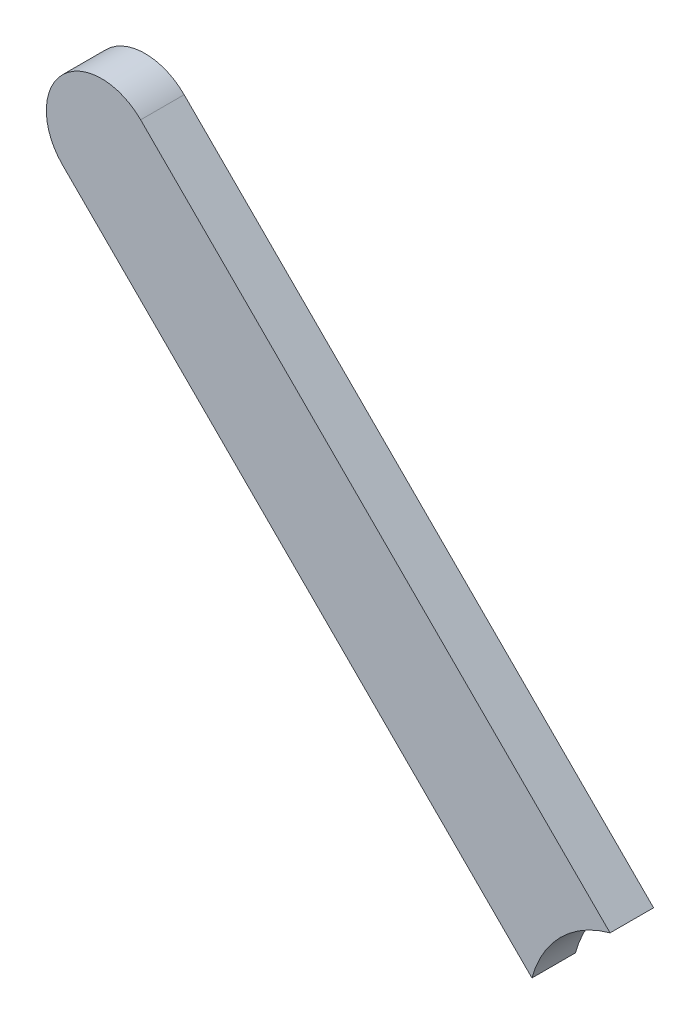
ISO-10303-21;
HEADER;
FILE_DESCRIPTION(('STEP AP214'),'2;1');
FILE_NAME('part.step','',(''),(''),'','','');
FILE_SCHEMA(('AUTOMOTIVE_DESIGN { 1 0 10303 214 1 1 1 1 }'));
ENDSEC;
DATA;
#1=APPLICATION_CONTEXT('core data for automotive mechanical design processes');
#2=APPLICATION_PROTOCOL_DEFINITION('international standard','automotive_design',2000,#1);
#3=PRODUCT_CONTEXT('',#1,'mechanical');
#4=PRODUCT('Part','Part','',(#3));
#5=PRODUCT_RELATED_PRODUCT_CATEGORY('part','',(#4));
#6=PRODUCT_DEFINITION_FORMATION('','',#4);
#7=PRODUCT_DEFINITION_CONTEXT('part definition',#1,'design');
#8=PRODUCT_DEFINITION('design','',#6,#7);
#9=PRODUCT_DEFINITION_SHAPE('','',#8);
#10=(LENGTH_UNIT() NAMED_UNIT(*) SI_UNIT(.MILLI.,.METRE.));
#11=(NAMED_UNIT(*) PLANE_ANGLE_UNIT() SI_UNIT($,.RADIAN.));
#12=(NAMED_UNIT(*) SI_UNIT($,.STERADIAN.) SOLID_ANGLE_UNIT());
#13=UNCERTAINTY_MEASURE_WITH_UNIT(LENGTH_MEASURE(1.E-05),#10,'distance_accuracy_value','');
#14=(GEOMETRIC_REPRESENTATION_CONTEXT(3) GLOBAL_UNCERTAINTY_ASSIGNED_CONTEXT((#13)) GLOBAL_UNIT_ASSIGNED_CONTEXT((#10,
#11,#12)) REPRESENTATION_CONTEXT('',''));
#15=CARTESIAN_POINT('',(0.,0.,0.));
#16=DIRECTION('',(0.,0.,1.));
#17=DIRECTION('',(1.,0.,0.));
#18=AXIS2_PLACEMENT_3D('',#15,#16,#17);
#19=CARTESIAN_POINT('',(150.131907,80.01388366,0.));
#20=DIRECTION('',(0.707106781186546,0.70710678118655,0.));
#21=DIRECTION('',(0.70710678118655,-0.707106781186546,0.));
#22=AXIS2_PLACEMENT_3D('',#19,#20,#21);
#23=PLANE('',#22);
#24=DIRECTION('',(0.70710678118655,-0.707106781186545,0.));
#25=VECTOR('',#24,1.);
#26=CARTESIAN_POINT('',(150.131907,80.01388366,0.1999996));
#27=LINE('',#26,#25);
#28=CARTESIAN_POINT('',(150.131907,80.01388366,0.1999996));
#29=VERTEX_POINT('',#28);
#30=CARTESIAN_POINT('',(152.290309871461,77.8554807885386,0.1999996));
#31=VERTEX_POINT('',#30);
#32=EDGE_CURVE('E11',#29,#31,#27,.T.);
#33=ORIENTED_EDGE('',*,*,#32,.F.);
#34=DIRECTION('',(0.,0.,1.));
#35=VECTOR('',#34,1.);
#36=CARTESIAN_POINT('',(150.131907,80.01388366,0.));
#37=LINE('',#36,#35);
#38=CARTESIAN_POINT('',(150.131907,80.01388366,0.));
#39=VERTEX_POINT('',#38);
#40=EDGE_CURVE('E24',#39,#29,#37,.T.);
#41=ORIENTED_EDGE('',*,*,#40,.F.);
#42=DIRECTION('',(0.70710678118655,-0.707106781186545,0.));
#43=VECTOR('',#42,1.);
#44=CARTESIAN_POINT('',(150.131907,80.01388366,0.));
#45=LINE('',#44,#43);
#46=CARTESIAN_POINT('',(152.290309871461,77.8554807885386,0.));
#47=VERTEX_POINT('',#46);
#48=EDGE_CURVE('E75',#39,#47,#45,.T.);
#49=ORIENTED_EDGE('',*,*,#48,.T.);
#50=DIRECTION('',(0.,0.,1.));
#51=VECTOR('',#50,1.);
#52=CARTESIAN_POINT('',(152.290309871461,77.8554807885386,0.));
#53=LINE('',#52,#51);
#54=EDGE_CURVE('E37',#47,#31,#53,.T.);
#55=ORIENTED_EDGE('',*,*,#54,.T.);
#56=EDGE_LOOP('',(#33,#41,#49,#55));
#57=FACE_BOUND('',#56,.T.);
#58=ADVANCED_FACE('F17',(#57),#23,.F.);
#59=CARTESIAN_POINT('',(152.781,77.724,0.));
#60=DIRECTION('',(0.,0.,-1.));
#61=DIRECTION('',(1.,0.,0.));
#62=AXIS2_PLACEMENT_3D('',#59,#60,#61);
#63=CYLINDRICAL_SURFACE('',#62,0.508);
#64=DIRECTION('',(0.,0.,1.));
#65=VECTOR('',#64,1.);
#66=CARTESIAN_POINT('',(152.649519211461,78.2146901285386,0.));
#67=LINE('',#66,#65);
#68=CARTESIAN_POINT('',(152.649519211461,78.2146901285386,0.));
#69=VERTEX_POINT('',#68);
#70=CARTESIAN_POINT('',(152.649519211461,78.2146901285386,0.1999996));
#71=VERTEX_POINT('',#70);
#72=EDGE_CURVE('E67',#69,#71,#67,.T.);
#73=ORIENTED_EDGE('',*,*,#72,.T.);
#74=CARTESIAN_POINT('',(152.781,77.724,0.1999996));
#75=DIRECTION('',(0.,0.,1.));
#76=DIRECTION('',(1.,0.,0.));
#77=AXIS2_PLACEMENT_3D('',#74,#75,#76);
#78=CIRCLE('',#77,0.508);
#79=EDGE_CURVE('E82',#71,#31,#78,.T.);
#80=ORIENTED_EDGE('',*,*,#79,.T.);
#81=ORIENTED_EDGE('',*,*,#54,.F.);
#82=CARTESIAN_POINT('',(152.781,77.724,0.));
#83=DIRECTION('',(0.,0.,1.));
#84=DIRECTION('',(1.,0.,0.));
#85=AXIS2_PLACEMENT_3D('',#82,#83,#84);
#86=CIRCLE('',#85,0.508);
#87=EDGE_CURVE('E80',#69,#47,#86,.T.);
#88=ORIENTED_EDGE('',*,*,#87,.F.);
#89=EDGE_LOOP('',(#73,#80,#81,#88));
#90=FACE_BOUND('',#89,.T.);
#91=ADVANCED_FACE('F88',(#90),#63,.F.);
#92=CARTESIAN_POINT('',(152.649519211461,78.2146901285386,0.));
#93=DIRECTION('',(-0.707106781186548,-0.707106781186548,0.));
#94=DIRECTION('',(-0.707106781186548,0.707106781186548,0.));
#95=AXIS2_PLACEMENT_3D('',#92,#93,#94);
#96=PLANE('',#95);
#97=DIRECTION('',(-0.707106781186548,0.707106781186548,0.));
#98=VECTOR('',#97,1.);
#99=CARTESIAN_POINT('',(152.9606034,77.90360594,0.1999996));
#100=LINE('',#99,#98);
#101=CARTESIAN_POINT('',(150.49111634,80.373093,0.1999996));
#102=VERTEX_POINT('',#101);
#103=EDGE_CURVE('E71',#71,#102,#100,.T.);
#104=ORIENTED_EDGE('',*,*,#103,.F.);
#105=ORIENTED_EDGE('',*,*,#72,.F.);
#106=DIRECTION('',(-0.707106781186548,0.707106781186548,0.));
#107=VECTOR('',#106,1.);
#108=CARTESIAN_POINT('',(152.9606034,77.90360594,0.));
#109=LINE('',#108,#107);
#110=CARTESIAN_POINT('',(150.49111634,80.373093,0.));
#111=VERTEX_POINT('',#110);
#112=EDGE_CURVE('E63',#69,#111,#109,.T.);
#113=ORIENTED_EDGE('',*,*,#112,.T.);
#114=DIRECTION('',(0.,0.,1.));
#115=VECTOR('',#114,1.);
#116=CARTESIAN_POINT('',(150.49111634,80.373093,0.));
#117=LINE('',#116,#115);
#118=EDGE_CURVE('E53',#111,#102,#117,.T.);
#119=ORIENTED_EDGE('',*,*,#118,.T.);
#120=EDGE_LOOP('',(#104,#105,#113,#119));
#121=FACE_BOUND('',#120,.T.);
#122=ADVANCED_FACE('F66',(#121),#96,.F.);
#123=CARTESIAN_POINT('',(150.31151167,80.19348833,0.));
#124=DIRECTION('',(0.,0.,-1.));
#125=DIRECTION('',(0.707106781186548,0.707106781186548,0.));
#126=AXIS2_PLACEMENT_3D('',#123,#124,#125);
#127=CYLINDRICAL_SURFACE('',#126,0.253999360179549);
#128=CARTESIAN_POINT('',(150.31151167,80.19348833,0.1999996));
#129=DIRECTION('',(0.,0.,1.));
#130=DIRECTION('',(0.707106781186548,0.707106781186548,0.));
#131=AXIS2_PLACEMENT_3D('',#128,#129,#130);
#132=CIRCLE('',#131,0.253999360179549);
#133=EDGE_CURVE('E59',#102,#29,#132,.T.);
#134=ORIENTED_EDGE('',*,*,#133,.F.);
#135=ORIENTED_EDGE('',*,*,#118,.F.);
#136=CARTESIAN_POINT('',(150.31151167,80.19348833,0.));
#137=DIRECTION('',(0.,0.,1.));
#138=DIRECTION('',(0.707106781186548,0.707106781186548,0.));
#139=AXIS2_PLACEMENT_3D('',#136,#137,#138);
#140=CIRCLE('',#139,0.253999360179549);
#141=EDGE_CURVE('E57',#111,#39,#140,.T.);
#142=ORIENTED_EDGE('',*,*,#141,.T.);
#143=ORIENTED_EDGE('',*,*,#40,.T.);
#144=EDGE_LOOP('',(#134,#135,#142,#143));
#145=FACE_BOUND('',#144,.T.);
#146=ADVANCED_FACE('F55',(#145),#127,.T.);
#147=CARTESIAN_POINT('',(150.131907,80.01388366,0.));
#148=DIRECTION('',(0.,0.,-1.));
#149=DIRECTION('',(-1.,0.,0.));
#150=AXIS2_PLACEMENT_3D('',#147,#148,#149);
#151=PLANE('',#150);
#152=ORIENTED_EDGE('',*,*,#48,.F.);
#153=ORIENTED_EDGE('',*,*,#141,.F.);
#154=ORIENTED_EDGE('',*,*,#112,.F.);
#155=ORIENTED_EDGE('',*,*,#87,.T.);
#156=EDGE_LOOP('',(#152,#153,#154,#155));
#157=FACE_BOUND('',#156,.T.);
#158=ADVANCED_FACE('F74',(#157),#151,.T.);
#159=CARTESIAN_POINT('',(150.131907,80.01388366,0.1999996));
#160=DIRECTION('',(0.,0.,-1.));
#161=DIRECTION('',(-1.,0.,0.));
#162=AXIS2_PLACEMENT_3D('',#159,#160,#161);
#163=PLANE('',#162);
#164=ORIENTED_EDGE('',*,*,#133,.T.);
#165=ORIENTED_EDGE('',*,*,#32,.T.);
#166=ORIENTED_EDGE('',*,*,#79,.F.);
#167=ORIENTED_EDGE('',*,*,#103,.T.);
#168=EDGE_LOOP('',(#164,#165,#166,#167));
#169=FACE_BOUND('',#168,.T.);
#170=ADVANCED_FACE('F91',(#169),#163,.F.);
#171=CLOSED_SHELL('',(#58,#91,#122,#146,#158,#170));
#172=MANIFOLD_SOLID_BREP('B1',#171);
#173=ADVANCED_BREP_SHAPE_REPRESENTATION('',(#18,#172),#14);
#174=SHAPE_DEFINITION_REPRESENTATION(#9,#173);
ENDSEC;
END-ISO-10303-21;
